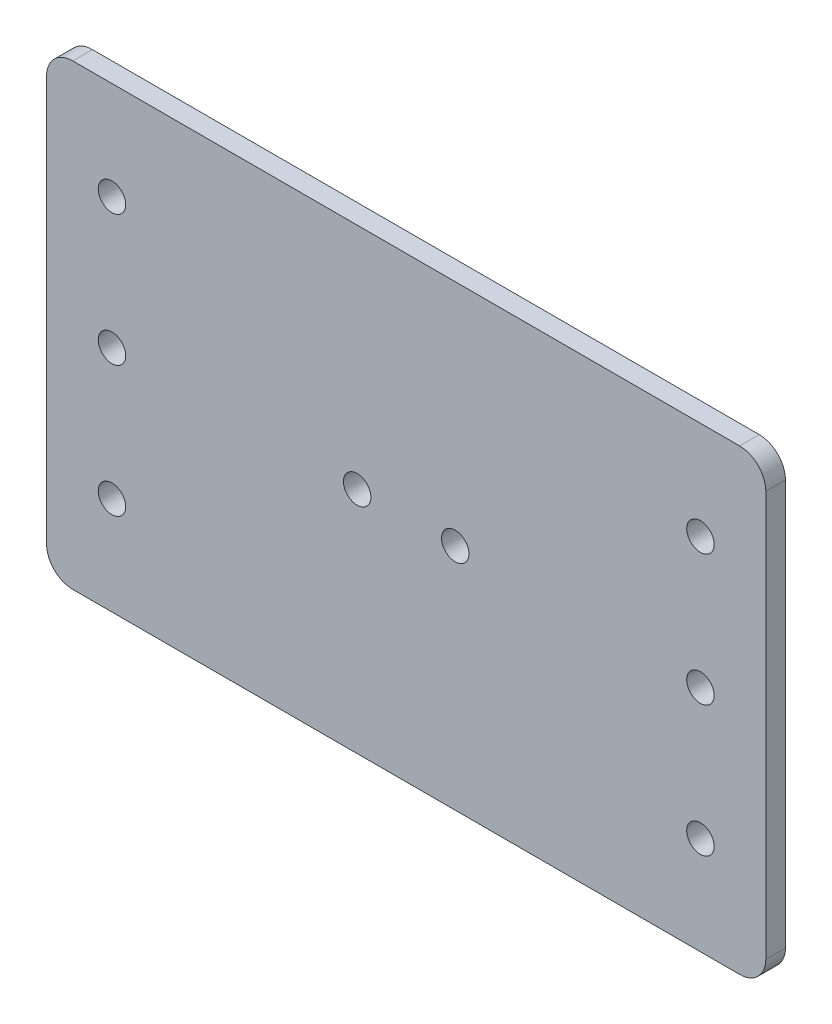
ISO-10303-21;
HEADER;
FILE_DESCRIPTION(('STEP AP214'),'2;1');
FILE_NAME('part.step','',(''),(''),'','','');
FILE_SCHEMA(('AUTOMOTIVE_DESIGN { 1 0 10303 214 1 1 1 1 }'));
ENDSEC;
DATA;
#1=APPLICATION_CONTEXT('core data for automotive mechanical design processes');
#2=APPLICATION_PROTOCOL_DEFINITION('international standard','automotive_design',2000,#1);
#3=PRODUCT_CONTEXT('',#1,'mechanical');
#4=PRODUCT('Part','Part','',(#3));
#5=PRODUCT_RELATED_PRODUCT_CATEGORY('part','',(#4));
#6=PRODUCT_DEFINITION_FORMATION('','',#4);
#7=PRODUCT_DEFINITION_CONTEXT('part definition',#1,'design');
#8=PRODUCT_DEFINITION('design','',#6,#7);
#9=PRODUCT_DEFINITION_SHAPE('','',#8);
#10=(LENGTH_UNIT() NAMED_UNIT(*) SI_UNIT(.MILLI.,.METRE.));
#11=(NAMED_UNIT(*) PLANE_ANGLE_UNIT() SI_UNIT($,.RADIAN.));
#12=(NAMED_UNIT(*) SI_UNIT($,.STERADIAN.) SOLID_ANGLE_UNIT());
#13=UNCERTAINTY_MEASURE_WITH_UNIT(LENGTH_MEASURE(1.E-05),#10,'distance_accuracy_value','');
#14=(GEOMETRIC_REPRESENTATION_CONTEXT(3) GLOBAL_UNCERTAINTY_ASSIGNED_CONTEXT((#13)) GLOBAL_UNIT_ASSIGNED_CONTEXT((#10,
#11,#12)) REPRESENTATION_CONTEXT('',''));
#15=CARTESIAN_POINT('',(0.,0.,0.));
#16=DIRECTION('',(0.,0.,1.));
#17=DIRECTION('',(1.,0.,0.));
#18=AXIS2_PLACEMENT_3D('',#15,#16,#17);
#19=CARTESIAN_POINT('',(0.,0.,3.));
#20=DIRECTION('',(0.,0.,1.));
#21=DIRECTION('',(1.,0.,0.));
#22=AXIS2_PLACEMENT_3D('',#19,#20,#21);
#23=PLANE('',#22);
#24=CARTESIAN_POINT('',(-45.0000000000002,0.,3.));
#25=DIRECTION('',(0.,0.,1.));
#26=DIRECTION('',(-1.,0.,0.));
#27=AXIS2_PLACEMENT_3D('',#24,#25,#26);
#28=CIRCLE('',#27,2.10000000000001);
#29=CARTESIAN_POINT('',(-47.1000000000002,0.,3.));
#30=VERTEX_POINT('',#29);
#31=EDGE_CURVE('E216',#30,#30,#28,.T.);
#32=ORIENTED_EDGE('',*,*,#31,.F.);
#33=EDGE_LOOP('',(#32));
#34=FACE_BOUND('',#33,.T.);
#35=CARTESIAN_POINT('',(7.5,0.,3.));
#36=DIRECTION('',(0.,0.,1.));
#37=DIRECTION('',(-1.,0.,0.));
#38=AXIS2_PLACEMENT_3D('',#35,#36,#37);
#39=CIRCLE('',#38,2.1);
#40=CARTESIAN_POINT('',(5.4,0.,3.));
#41=VERTEX_POINT('',#40);
#42=EDGE_CURVE('E204',#41,#41,#39,.T.);
#43=ORIENTED_EDGE('',*,*,#42,.F.);
#44=EDGE_LOOP('',(#43));
#45=FACE_BOUND('',#44,.T.);
#46=CARTESIAN_POINT('',(45.0000000000002,0.,3.));
#47=DIRECTION('',(0.,0.,1.));
#48=DIRECTION('',(1.,0.,0.));
#49=AXIS2_PLACEMENT_3D('',#46,#47,#48);
#50=CIRCLE('',#49,2.1);
#51=CARTESIAN_POINT('',(47.1000000000002,0.,3.));
#52=VERTEX_POINT('',#51);
#53=EDGE_CURVE('E192',#52,#52,#50,.T.);
#54=ORIENTED_EDGE('',*,*,#53,.F.);
#55=EDGE_LOOP('',(#54));
#56=FACE_BOUND('',#55,.T.);
#57=CARTESIAN_POINT('',(-7.49999999999999,0.,3.));
#58=DIRECTION('',(0.,0.,1.));
#59=DIRECTION('',(1.,0.,0.));
#60=AXIS2_PLACEMENT_3D('',#57,#58,#59);
#61=CIRCLE('',#60,2.1);
#62=CARTESIAN_POINT('',(-5.39999999999999,0.,3.));
#63=VERTEX_POINT('',#62);
#64=EDGE_CURVE('E138',#63,#63,#61,.T.);
#65=ORIENTED_EDGE('',*,*,#64,.F.);
#66=EDGE_LOOP('',(#65));
#67=FACE_BOUND('',#66,.T.);
#68=DIRECTION('',(0.,1.,0.));
#69=VECTOR('',#68,1.);
#70=CARTESIAN_POINT('',(55.,35.,3.));
#71=LINE('',#70,#69);
#72=CARTESIAN_POINT('',(55.,-31.,3.));
#73=VERTEX_POINT('',#72);
#74=CARTESIAN_POINT('',(55.,31.,3.));
#75=VERTEX_POINT('',#74);
#76=EDGE_CURVE('E143',#73,#75,#71,.T.);
#77=ORIENTED_EDGE('',*,*,#76,.T.);
#78=CARTESIAN_POINT('',(51.,31.,3.));
#79=DIRECTION('',(0.,0.,1.));
#80=DIRECTION('',(1.,0.,0.));
#81=AXIS2_PLACEMENT_3D('',#78,#79,#80);
#82=CIRCLE('',#81,4.);
#83=CARTESIAN_POINT('',(51.,35.,3.));
#84=VERTEX_POINT('',#83);
#85=EDGE_CURVE('E158',#75,#84,#82,.T.);
#86=ORIENTED_EDGE('',*,*,#85,.T.);
#87=DIRECTION('',(-1.,0.,0.));
#88=VECTOR('',#87,1.);
#89=CARTESIAN_POINT('',(-55.,35.,3.));
#90=LINE('',#89,#88);
#91=CARTESIAN_POINT('',(-51.,35.,3.));
#92=VERTEX_POINT('',#91);
#93=EDGE_CURVE('E125',#84,#92,#90,.T.);
#94=ORIENTED_EDGE('',*,*,#93,.T.);
#95=CARTESIAN_POINT('',(-51.,31.,3.));
#96=DIRECTION('',(0.,0.,1.));
#97=DIRECTION('',(1.,0.,0.));
#98=AXIS2_PLACEMENT_3D('',#95,#96,#97);
#99=CIRCLE('',#98,4.);
#100=CARTESIAN_POINT('',(-55.,31.,3.));
#101=VERTEX_POINT('',#100);
#102=EDGE_CURVE('E153',#92,#101,#99,.T.);
#103=ORIENTED_EDGE('',*,*,#102,.T.);
#104=DIRECTION('',(0.,-1.,0.));
#105=VECTOR('',#104,1.);
#106=CARTESIAN_POINT('',(-55.,35.,3.));
#107=LINE('',#106,#105);
#108=CARTESIAN_POINT('',(-55.,-31.0000000000001,3.));
#109=VERTEX_POINT('',#108);
#110=EDGE_CURVE('E169',#101,#109,#107,.T.);
#111=ORIENTED_EDGE('',*,*,#110,.T.);
#112=CARTESIAN_POINT('',(-51.,-31.0000000000001,3.));
#113=DIRECTION('',(0.,0.,1.));
#114=DIRECTION('',(1.,0.,0.));
#115=AXIS2_PLACEMENT_3D('',#112,#113,#114);
#116=CIRCLE('',#115,4.);
#117=CARTESIAN_POINT('',(-51.,-35.,3.));
#118=VERTEX_POINT('',#117);
#119=EDGE_CURVE('E61',#109,#118,#116,.T.);
#120=ORIENTED_EDGE('',*,*,#119,.T.);
#121=DIRECTION('',(1.,0.,0.));
#122=VECTOR('',#121,1.);
#123=CARTESIAN_POINT('',(-55.,-35.,3.));
#124=LINE('',#123,#122);
#125=CARTESIAN_POINT('',(51.,-35.,3.));
#126=VERTEX_POINT('',#125);
#127=EDGE_CURVE('E144',#118,#126,#124,.T.);
#128=ORIENTED_EDGE('',*,*,#127,.T.);
#129=CARTESIAN_POINT('',(51.,-31.,3.));
#130=DIRECTION('',(0.,0.,1.));
#131=DIRECTION('',(1.,0.,0.));
#132=AXIS2_PLACEMENT_3D('',#129,#130,#131);
#133=CIRCLE('',#132,4.);
#134=EDGE_CURVE('E156',#126,#73,#133,.T.);
#135=ORIENTED_EDGE('',*,*,#134,.T.);
#136=EDGE_LOOP('',(#77,#86,#94,#103,#111,#120,#128,#135));
#137=FACE_BOUND('',#136,.T.);
#138=CARTESIAN_POINT('',(45.,20.,3.));
#139=DIRECTION('',(0.,0.,1.));
#140=DIRECTION('',(1.,0.,0.));
#141=AXIS2_PLACEMENT_3D('',#138,#139,#140);
#142=CIRCLE('',#141,2.1);
#143=CARTESIAN_POINT('',(47.1,20.,3.));
#144=VERTEX_POINT('',#143);
#145=EDGE_CURVE('E186',#144,#144,#142,.T.);
#146=ORIENTED_EDGE('',*,*,#145,.F.);
#147=EDGE_LOOP('',(#146));
#148=FACE_BOUND('',#147,.T.);
#149=CARTESIAN_POINT('',(45.0000000000004,-20.,3.));
#150=DIRECTION('',(0.,0.,1.));
#151=DIRECTION('',(1.,0.,0.));
#152=AXIS2_PLACEMENT_3D('',#149,#150,#151);
#153=CIRCLE('',#152,2.1);
#154=CARTESIAN_POINT('',(47.1000000000004,-20.,3.));
#155=VERTEX_POINT('',#154);
#156=EDGE_CURVE('E198',#155,#155,#153,.T.);
#157=ORIENTED_EDGE('',*,*,#156,.F.);
#158=EDGE_LOOP('',(#157));
#159=FACE_BOUND('',#158,.T.);
#160=CARTESIAN_POINT('',(-45.,20.,3.));
#161=DIRECTION('',(0.,0.,1.));
#162=DIRECTION('',(-1.,0.,0.));
#163=AXIS2_PLACEMENT_3D('',#160,#161,#162);
#164=CIRCLE('',#163,2.1);
#165=CARTESIAN_POINT('',(-47.1,20.,3.));
#166=VERTEX_POINT('',#165);
#167=EDGE_CURVE('E210',#166,#166,#164,.T.);
#168=ORIENTED_EDGE('',*,*,#167,.F.);
#169=EDGE_LOOP('',(#168));
#170=FACE_BOUND('',#169,.T.);
#171=CARTESIAN_POINT('',(-45.0000000000004,-20.,3.));
#172=DIRECTION('',(0.,0.,1.));
#173=DIRECTION('',(-1.,0.,0.));
#174=AXIS2_PLACEMENT_3D('',#171,#172,#173);
#175=CIRCLE('',#174,2.1);
#176=CARTESIAN_POINT('',(-47.1000000000004,-20.,3.));
#177=VERTEX_POINT('',#176);
#178=EDGE_CURVE('E222',#177,#177,#175,.T.);
#179=ORIENTED_EDGE('',*,*,#178,.F.);
#180=EDGE_LOOP('',(#179));
#181=FACE_BOUND('',#180,.T.);
#182=ADVANCED_FACE('F39',(#34,#45,#56,#67,#137,#148,#159,#170,#181),#23,.T.);
#183=CARTESIAN_POINT('',(0.,0.,0.));
#184=DIRECTION('',(0.,0.,1.));
#185=DIRECTION('',(1.,0.,0.));
#186=AXIS2_PLACEMENT_3D('',#183,#184,#185);
#187=PLANE('',#186);
#188=DIRECTION('',(-1.,0.,0.));
#189=VECTOR('',#188,1.);
#190=CARTESIAN_POINT('',(-55.,35.,0.));
#191=LINE('',#190,#189);
#192=CARTESIAN_POINT('',(51.,35.,0.));
#193=VERTEX_POINT('',#192);
#194=CARTESIAN_POINT('',(-51.,35.,0.));
#195=VERTEX_POINT('',#194);
#196=EDGE_CURVE('E122',#193,#195,#191,.T.);
#197=ORIENTED_EDGE('',*,*,#196,.F.);
#198=CARTESIAN_POINT('',(51.,31.,0.));
#199=DIRECTION('',(0.,0.,1.));
#200=DIRECTION('',(1.,0.,0.));
#201=AXIS2_PLACEMENT_3D('',#198,#199,#200);
#202=CIRCLE('',#201,4.);
#203=CARTESIAN_POINT('',(55.,31.,0.));
#204=VERTEX_POINT('',#203);
#205=EDGE_CURVE('E105',#193,#204,#202,.F.);
#206=ORIENTED_EDGE('',*,*,#205,.T.);
#207=DIRECTION('',(0.,1.,0.));
#208=VECTOR('',#207,1.);
#209=CARTESIAN_POINT('',(55.,35.,0.));
#210=LINE('',#209,#208);
#211=CARTESIAN_POINT('',(55.,-31.,0.));
#212=VERTEX_POINT('',#211);
#213=EDGE_CURVE('E133',#212,#204,#210,.T.);
#214=ORIENTED_EDGE('',*,*,#213,.F.);
#215=CARTESIAN_POINT('',(51.,-31.,0.));
#216=DIRECTION('',(0.,0.,1.));
#217=DIRECTION('',(1.,0.,0.));
#218=AXIS2_PLACEMENT_3D('',#215,#216,#217);
#219=CIRCLE('',#218,4.);
#220=CARTESIAN_POINT('',(51.,-35.,0.));
#221=VERTEX_POINT('',#220);
#222=EDGE_CURVE('E116',#212,#221,#219,.F.);
#223=ORIENTED_EDGE('',*,*,#222,.T.);
#224=DIRECTION('',(1.,0.,0.));
#225=VECTOR('',#224,1.);
#226=CARTESIAN_POINT('',(-55.,-35.,0.));
#227=LINE('',#226,#225);
#228=CARTESIAN_POINT('',(-51.,-35.,0.));
#229=VERTEX_POINT('',#228);
#230=EDGE_CURVE('E136',#229,#221,#227,.T.);
#231=ORIENTED_EDGE('',*,*,#230,.F.);
#232=CARTESIAN_POINT('',(-51.,-31.0000000000001,0.));
#233=DIRECTION('',(0.,0.,1.));
#234=DIRECTION('',(1.,0.,0.));
#235=AXIS2_PLACEMENT_3D('',#232,#233,#234);
#236=CIRCLE('',#235,4.);
#237=CARTESIAN_POINT('',(-55.,-31.0000000000001,0.));
#238=VERTEX_POINT('',#237);
#239=EDGE_CURVE('E147',#229,#238,#236,.F.);
#240=ORIENTED_EDGE('',*,*,#239,.T.);
#241=DIRECTION('',(0.,-1.,0.));
#242=VECTOR('',#241,1.);
#243=CARTESIAN_POINT('',(-55.,35.,0.));
#244=LINE('',#243,#242);
#245=CARTESIAN_POINT('',(-55.,31.,0.));
#246=VERTEX_POINT('',#245);
#247=EDGE_CURVE('E132',#246,#238,#244,.T.);
#248=ORIENTED_EDGE('',*,*,#247,.F.);
#249=CARTESIAN_POINT('',(-51.,31.,0.));
#250=DIRECTION('',(0.,0.,1.));
#251=DIRECTION('',(1.,0.,0.));
#252=AXIS2_PLACEMENT_3D('',#249,#250,#251);
#253=CIRCLE('',#252,4.);
#254=EDGE_CURVE('E126',#246,#195,#253,.F.);
#255=ORIENTED_EDGE('',*,*,#254,.T.);
#256=EDGE_LOOP('',(#197,#206,#214,#223,#231,#240,#248,#255));
#257=FACE_BOUND('',#256,.T.);
#258=CARTESIAN_POINT('',(-7.49999999999999,0.,0.));
#259=DIRECTION('',(0.,0.,1.));
#260=DIRECTION('',(1.,0.,0.));
#261=AXIS2_PLACEMENT_3D('',#258,#259,#260);
#262=CIRCLE('',#261,2.1);
#263=CARTESIAN_POINT('',(-5.39999999999999,0.,0.));
#264=VERTEX_POINT('',#263);
#265=EDGE_CURVE('E183',#264,#264,#262,.T.);
#266=ORIENTED_EDGE('',*,*,#265,.T.);
#267=EDGE_LOOP('',(#266));
#268=FACE_BOUND('',#267,.T.);
#269=CARTESIAN_POINT('',(45.,20.,0.));
#270=DIRECTION('',(0.,0.,1.));
#271=DIRECTION('',(1.,0.,0.));
#272=AXIS2_PLACEMENT_3D('',#269,#270,#271);
#273=CIRCLE('',#272,2.1);
#274=CARTESIAN_POINT('',(47.1,20.,0.));
#275=VERTEX_POINT('',#274);
#276=EDGE_CURVE('E189',#275,#275,#273,.T.);
#277=ORIENTED_EDGE('',*,*,#276,.T.);
#278=EDGE_LOOP('',(#277));
#279=FACE_BOUND('',#278,.T.);
#280=CARTESIAN_POINT('',(45.0000000000002,0.,0.));
#281=DIRECTION('',(0.,0.,1.));
#282=DIRECTION('',(1.,0.,0.));
#283=AXIS2_PLACEMENT_3D('',#280,#281,#282);
#284=CIRCLE('',#283,2.1);
#285=CARTESIAN_POINT('',(47.1000000000002,0.,0.));
#286=VERTEX_POINT('',#285);
#287=EDGE_CURVE('E195',#286,#286,#284,.T.);
#288=ORIENTED_EDGE('',*,*,#287,.T.);
#289=EDGE_LOOP('',(#288));
#290=FACE_BOUND('',#289,.T.);
#291=CARTESIAN_POINT('',(45.0000000000004,-20.,0.));
#292=DIRECTION('',(0.,0.,1.));
#293=DIRECTION('',(1.,0.,0.));
#294=AXIS2_PLACEMENT_3D('',#291,#292,#293);
#295=CIRCLE('',#294,2.1);
#296=CARTESIAN_POINT('',(47.1000000000004,-20.,0.));
#297=VERTEX_POINT('',#296);
#298=EDGE_CURVE('E201',#297,#297,#295,.T.);
#299=ORIENTED_EDGE('',*,*,#298,.T.);
#300=EDGE_LOOP('',(#299));
#301=FACE_BOUND('',#300,.T.);
#302=CARTESIAN_POINT('',(7.5,0.,0.));
#303=DIRECTION('',(0.,0.,1.));
#304=DIRECTION('',(-1.,0.,0.));
#305=AXIS2_PLACEMENT_3D('',#302,#303,#304);
#306=CIRCLE('',#305,2.1);
#307=CARTESIAN_POINT('',(5.4,0.,0.));
#308=VERTEX_POINT('',#307);
#309=EDGE_CURVE('E207',#308,#308,#306,.T.);
#310=ORIENTED_EDGE('',*,*,#309,.T.);
#311=EDGE_LOOP('',(#310));
#312=FACE_BOUND('',#311,.T.);
#313=CARTESIAN_POINT('',(-45.,20.,0.));
#314=DIRECTION('',(0.,0.,1.));
#315=DIRECTION('',(-1.,0.,0.));
#316=AXIS2_PLACEMENT_3D('',#313,#314,#315);
#317=CIRCLE('',#316,2.1);
#318=CARTESIAN_POINT('',(-47.1,20.,0.));
#319=VERTEX_POINT('',#318);
#320=EDGE_CURVE('E213',#319,#319,#317,.T.);
#321=ORIENTED_EDGE('',*,*,#320,.T.);
#322=EDGE_LOOP('',(#321));
#323=FACE_BOUND('',#322,.T.);
#324=CARTESIAN_POINT('',(-45.0000000000002,0.,0.));
#325=DIRECTION('',(0.,0.,1.));
#326=DIRECTION('',(-1.,0.,0.));
#327=AXIS2_PLACEMENT_3D('',#324,#325,#326);
#328=CIRCLE('',#327,2.10000000000001);
#329=CARTESIAN_POINT('',(-47.1000000000002,0.,0.));
#330=VERTEX_POINT('',#329);
#331=EDGE_CURVE('E219',#330,#330,#328,.T.);
#332=ORIENTED_EDGE('',*,*,#331,.T.);
#333=EDGE_LOOP('',(#332));
#334=FACE_BOUND('',#333,.T.);
#335=CARTESIAN_POINT('',(-45.0000000000004,-20.,0.));
#336=DIRECTION('',(0.,0.,1.));
#337=DIRECTION('',(-1.,0.,0.));
#338=AXIS2_PLACEMENT_3D('',#335,#336,#337);
#339=CIRCLE('',#338,2.1);
#340=CARTESIAN_POINT('',(-47.1000000000004,-20.,0.));
#341=VERTEX_POINT('',#340);
#342=EDGE_CURVE('E225',#341,#341,#339,.T.);
#343=ORIENTED_EDGE('',*,*,#342,.T.);
#344=EDGE_LOOP('',(#343));
#345=FACE_BOUND('',#344,.T.);
#346=ADVANCED_FACE('F129',(#257,#268,#279,#290,#301,#312,#323,#334,#345),#187,.F.);
#347=CARTESIAN_POINT('',(55.,35.,3.));
#348=DIRECTION('',(-1.,0.,0.));
#349=DIRECTION('',(0.,-1.,0.));
#350=AXIS2_PLACEMENT_3D('',#347,#348,#349);
#351=PLANE('',#350);
#352=ORIENTED_EDGE('',*,*,#213,.T.);
#353=DIRECTION('',(0.,0.,-1.));
#354=VECTOR('',#353,1.);
#355=CARTESIAN_POINT('',(55.,31.,3.));
#356=LINE('',#355,#354);
#357=EDGE_CURVE('E110',#204,#75,#356,.F.);
#358=ORIENTED_EDGE('',*,*,#357,.T.);
#359=ORIENTED_EDGE('',*,*,#76,.F.);
#360=DIRECTION('',(0.,0.,-1.));
#361=VECTOR('',#360,1.);
#362=CARTESIAN_POINT('',(55.,-31.,3.));
#363=LINE('',#362,#361);
#364=EDGE_CURVE('E115',#73,#212,#363,.T.);
#365=ORIENTED_EDGE('',*,*,#364,.T.);
#366=EDGE_LOOP('',(#352,#358,#359,#365));
#367=FACE_BOUND('',#366,.T.);
#368=ADVANCED_FACE('F240',(#367),#351,.F.);
#369=CARTESIAN_POINT('',(-55.,35.,3.));
#370=DIRECTION('',(0.,-1.,0.));
#371=DIRECTION('',(1.,0.,0.));
#372=AXIS2_PLACEMENT_3D('',#369,#370,#371);
#373=PLANE('',#372);
#374=ORIENTED_EDGE('',*,*,#93,.F.);
#375=DIRECTION('',(0.,0.,-1.));
#376=VECTOR('',#375,1.);
#377=CARTESIAN_POINT('',(51.,35.,3.));
#378=LINE('',#377,#376);
#379=EDGE_CURVE('E109',#84,#193,#378,.T.);
#380=ORIENTED_EDGE('',*,*,#379,.T.);
#381=ORIENTED_EDGE('',*,*,#196,.T.);
#382=DIRECTION('',(0.,0.,-1.));
#383=VECTOR('',#382,1.);
#384=CARTESIAN_POINT('',(-51.,35.,3.));
#385=LINE('',#384,#383);
#386=EDGE_CURVE('E127',#195,#92,#385,.F.);
#387=ORIENTED_EDGE('',*,*,#386,.T.);
#388=EDGE_LOOP('',(#374,#380,#381,#387));
#389=FACE_BOUND('',#388,.T.);
#390=ADVANCED_FACE('F121',(#389),#373,.F.);
#391=CARTESIAN_POINT('',(-55.,35.,3.));
#392=DIRECTION('',(1.,0.,0.));
#393=DIRECTION('',(0.,1.,0.));
#394=AXIS2_PLACEMENT_3D('',#391,#392,#393);
#395=PLANE('',#394);
#396=ORIENTED_EDGE('',*,*,#247,.T.);
#397=DIRECTION('',(0.,0.,-1.));
#398=VECTOR('',#397,1.);
#399=CARTESIAN_POINT('',(-55.,-31.0000000000001,3.));
#400=LINE('',#399,#398);
#401=EDGE_CURVE('E11',#238,#109,#400,.F.);
#402=ORIENTED_EDGE('',*,*,#401,.T.);
#403=ORIENTED_EDGE('',*,*,#110,.F.);
#404=DIRECTION('',(0.,0.,-1.));
#405=VECTOR('',#404,1.);
#406=CARTESIAN_POINT('',(-55.,31.,3.));
#407=LINE('',#406,#405);
#408=EDGE_CURVE('E47',#101,#246,#407,.T.);
#409=ORIENTED_EDGE('',*,*,#408,.T.);
#410=EDGE_LOOP('',(#396,#402,#403,#409));
#411=FACE_BOUND('',#410,.T.);
#412=ADVANCED_FACE('F167',(#411),#395,.F.);
#413=CARTESIAN_POINT('',(-55.,-35.,3.));
#414=DIRECTION('',(0.,1.,0.));
#415=DIRECTION('',(-1.,0.,0.));
#416=AXIS2_PLACEMENT_3D('',#413,#414,#415);
#417=PLANE('',#416);
#418=ORIENTED_EDGE('',*,*,#230,.T.);
#419=DIRECTION('',(0.,0.,-1.));
#420=VECTOR('',#419,1.);
#421=CARTESIAN_POINT('',(51.,-35.,3.));
#422=LINE('',#421,#420);
#423=EDGE_CURVE('E54',#221,#126,#422,.F.);
#424=ORIENTED_EDGE('',*,*,#423,.T.);
#425=ORIENTED_EDGE('',*,*,#127,.F.);
#426=DIRECTION('',(0.,0.,-1.));
#427=VECTOR('',#426,1.);
#428=CARTESIAN_POINT('',(-51.,-35.,3.));
#429=LINE('',#428,#427);
#430=EDGE_CURVE('E160',#118,#229,#429,.T.);
#431=ORIENTED_EDGE('',*,*,#430,.T.);
#432=EDGE_LOOP('',(#418,#424,#425,#431));
#433=FACE_BOUND('',#432,.T.);
#434=ADVANCED_FACE('F176',(#433),#417,.F.);
#435=CARTESIAN_POINT('',(-7.49999999999999,0.,3.));
#436=DIRECTION('',(0.,0.,-1.));
#437=DIRECTION('',(-1.,0.,0.));
#438=AXIS2_PLACEMENT_3D('',#435,#436,#437);
#439=CYLINDRICAL_SURFACE('',#438,2.1);
#440=ORIENTED_EDGE('',*,*,#64,.T.);
#441=EDGE_LOOP('',(#440));
#442=FACE_BOUND('',#441,.T.);
#443=ORIENTED_EDGE('',*,*,#265,.F.);
#444=EDGE_LOOP('',(#443));
#445=FACE_BOUND('',#444,.T.);
#446=ADVANCED_FACE('F245',(#442,#445),#439,.F.);
#447=CARTESIAN_POINT('',(45.,20.,3.));
#448=DIRECTION('',(0.,0.,-1.));
#449=DIRECTION('',(-1.,0.,0.));
#450=AXIS2_PLACEMENT_3D('',#447,#448,#449);
#451=CYLINDRICAL_SURFACE('',#450,2.1);
#452=ORIENTED_EDGE('',*,*,#145,.T.);
#453=EDGE_LOOP('',(#452));
#454=FACE_BOUND('',#453,.T.);
#455=ORIENTED_EDGE('',*,*,#276,.F.);
#456=EDGE_LOOP('',(#455));
#457=FACE_BOUND('',#456,.T.);
#458=ADVANCED_FACE('F306',(#454,#457),#451,.F.);
#459=CARTESIAN_POINT('',(45.0000000000002,0.,3.));
#460=DIRECTION('',(0.,0.,-1.));
#461=DIRECTION('',(-1.,0.,0.));
#462=AXIS2_PLACEMENT_3D('',#459,#460,#461);
#463=CYLINDRICAL_SURFACE('',#462,2.1);
#464=ORIENTED_EDGE('',*,*,#53,.T.);
#465=EDGE_LOOP('',(#464));
#466=FACE_BOUND('',#465,.T.);
#467=ORIENTED_EDGE('',*,*,#287,.F.);
#468=EDGE_LOOP('',(#467));
#469=FACE_BOUND('',#468,.T.);
#470=ADVANCED_FACE('F303',(#466,#469),#463,.F.);
#471=CARTESIAN_POINT('',(45.0000000000004,-20.,3.));
#472=DIRECTION('',(0.,0.,-1.));
#473=DIRECTION('',(-1.,0.,0.));
#474=AXIS2_PLACEMENT_3D('',#471,#472,#473);
#475=CYLINDRICAL_SURFACE('',#474,2.1);
#476=ORIENTED_EDGE('',*,*,#156,.T.);
#477=EDGE_LOOP('',(#476));
#478=FACE_BOUND('',#477,.T.);
#479=ORIENTED_EDGE('',*,*,#298,.F.);
#480=EDGE_LOOP('',(#479));
#481=FACE_BOUND('',#480,.T.);
#482=ADVANCED_FACE('F299',(#478,#481),#475,.F.);
#483=CARTESIAN_POINT('',(7.5,0.,3.));
#484=DIRECTION('',(0.,0.,-1.));
#485=DIRECTION('',(-1.,0.,0.));
#486=AXIS2_PLACEMENT_3D('',#483,#484,#485);
#487=CYLINDRICAL_SURFACE('',#486,2.1);
#488=ORIENTED_EDGE('',*,*,#42,.T.);
#489=EDGE_LOOP('',(#488));
#490=FACE_BOUND('',#489,.T.);
#491=ORIENTED_EDGE('',*,*,#309,.F.);
#492=EDGE_LOOP('',(#491));
#493=FACE_BOUND('',#492,.T.);
#494=ADVANCED_FACE('F281',(#490,#493),#487,.F.);
#495=CARTESIAN_POINT('',(-45.,20.,3.));
#496=DIRECTION('',(0.,0.,-1.));
#497=DIRECTION('',(-1.,0.,0.));
#498=AXIS2_PLACEMENT_3D('',#495,#496,#497);
#499=CYLINDRICAL_SURFACE('',#498,2.1);
#500=ORIENTED_EDGE('',*,*,#167,.T.);
#501=EDGE_LOOP('',(#500));
#502=FACE_BOUND('',#501,.T.);
#503=ORIENTED_EDGE('',*,*,#320,.F.);
#504=EDGE_LOOP('',(#503));
#505=FACE_BOUND('',#504,.T.);
#506=ADVANCED_FACE('F277',(#502,#505),#499,.F.);
#507=CARTESIAN_POINT('',(-45.0000000000002,0.,3.));
#508=DIRECTION('',(0.,0.,-1.));
#509=DIRECTION('',(-1.,0.,0.));
#510=AXIS2_PLACEMENT_3D('',#507,#508,#509);
#511=CYLINDRICAL_SURFACE('',#510,2.10000000000001);
#512=ORIENTED_EDGE('',*,*,#31,.T.);
#513=EDGE_LOOP('',(#512));
#514=FACE_BOUND('',#513,.T.);
#515=ORIENTED_EDGE('',*,*,#331,.F.);
#516=EDGE_LOOP('',(#515));
#517=FACE_BOUND('',#516,.T.);
#518=ADVANCED_FACE('F280',(#514,#517),#511,.F.);
#519=CARTESIAN_POINT('',(-45.0000000000004,-20.,3.));
#520=DIRECTION('',(0.,0.,-1.));
#521=DIRECTION('',(-1.,0.,0.));
#522=AXIS2_PLACEMENT_3D('',#519,#520,#521);
#523=CYLINDRICAL_SURFACE('',#522,2.1);
#524=ORIENTED_EDGE('',*,*,#178,.T.);
#525=EDGE_LOOP('',(#524));
#526=FACE_BOUND('',#525,.T.);
#527=ORIENTED_EDGE('',*,*,#342,.F.);
#528=EDGE_LOOP('',(#527));
#529=FACE_BOUND('',#528,.T.);
#530=ADVANCED_FACE('F231',(#526,#529),#523,.F.);
#531=CARTESIAN_POINT('',(51.,31.,3.));
#532=DIRECTION('',(0.,0.,-1.));
#533=DIRECTION('',(-1.,0.,0.));
#534=AXIS2_PLACEMENT_3D('',#531,#532,#533);
#535=CYLINDRICAL_SURFACE('',#534,4.);
#536=ORIENTED_EDGE('',*,*,#85,.F.);
#537=ORIENTED_EDGE('',*,*,#357,.F.);
#538=ORIENTED_EDGE('',*,*,#205,.F.);
#539=ORIENTED_EDGE('',*,*,#379,.F.);
#540=EDGE_LOOP('',(#536,#537,#538,#539));
#541=FACE_BOUND('',#540,.T.);
#542=ADVANCED_FACE('F108',(#541),#535,.T.);
#543=CARTESIAN_POINT('',(51.,-31.,3.));
#544=DIRECTION('',(0.,0.,-1.));
#545=DIRECTION('',(-1.,0.,0.));
#546=AXIS2_PLACEMENT_3D('',#543,#544,#545);
#547=CYLINDRICAL_SURFACE('',#546,4.);
#548=ORIENTED_EDGE('',*,*,#134,.F.);
#549=ORIENTED_EDGE('',*,*,#423,.F.);
#550=ORIENTED_EDGE('',*,*,#222,.F.);
#551=ORIENTED_EDGE('',*,*,#364,.F.);
#552=EDGE_LOOP('',(#548,#549,#550,#551));
#553=FACE_BOUND('',#552,.T.);
#554=ADVANCED_FACE('F259',(#553),#547,.T.);
#555=CARTESIAN_POINT('',(-51.,-31.0000000000001,3.));
#556=DIRECTION('',(0.,0.,-1.));
#557=DIRECTION('',(-1.,0.,0.));
#558=AXIS2_PLACEMENT_3D('',#555,#556,#557);
#559=CYLINDRICAL_SURFACE('',#558,4.);
#560=ORIENTED_EDGE('',*,*,#119,.F.);
#561=ORIENTED_EDGE('',*,*,#401,.F.);
#562=ORIENTED_EDGE('',*,*,#239,.F.);
#563=ORIENTED_EDGE('',*,*,#430,.F.);
#564=EDGE_LOOP('',(#560,#561,#562,#563));
#565=FACE_BOUND('',#564,.T.);
#566=ADVANCED_FACE('F175',(#565),#559,.T.);
#567=CARTESIAN_POINT('',(-51.,31.,3.));
#568=DIRECTION('',(0.,0.,-1.));
#569=DIRECTION('',(-1.,0.,0.));
#570=AXIS2_PLACEMENT_3D('',#567,#568,#569);
#571=CYLINDRICAL_SURFACE('',#570,4.);
#572=ORIENTED_EDGE('',*,*,#102,.F.);
#573=ORIENTED_EDGE('',*,*,#386,.F.);
#574=ORIENTED_EDGE('',*,*,#254,.F.);
#575=ORIENTED_EDGE('',*,*,#408,.F.);
#576=EDGE_LOOP('',(#572,#573,#574,#575));
#577=FACE_BOUND('',#576,.T.);
#578=ADVANCED_FACE('F41',(#577),#571,.T.);
#579=CLOSED_SHELL('',(#182,#346,#368,#390,#412,#434,#446,#458,#470,#482,#494,#506,#518,#530,
#542,#554,#566,#578));
#580=MANIFOLD_SOLID_BREP('B2',#579);
#581=ADVANCED_BREP_SHAPE_REPRESENTATION('',(#18,#580),#14);
#582=SHAPE_DEFINITION_REPRESENTATION(#9,#581);
ENDSEC;
END-ISO-10303-21;
